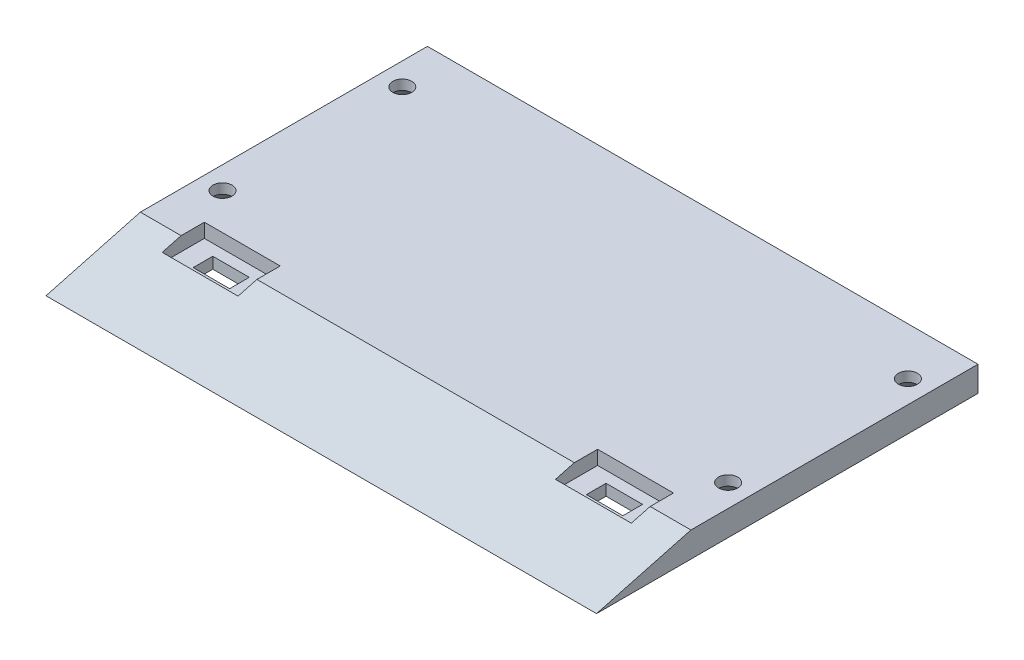
ISO-10303-21;
HEADER;
FILE_DESCRIPTION(('STEP AP214'),'2;1');
FILE_NAME('part.step','',(''),(''),'','','');
FILE_SCHEMA(('AUTOMOTIVE_DESIGN { 1 0 10303 214 1 1 1 1 }'));
ENDSEC;
DATA;
#1=APPLICATION_CONTEXT('core data for automotive mechanical design processes');
#2=APPLICATION_PROTOCOL_DEFINITION('international standard','automotive_design',2000,#1);
#3=PRODUCT_CONTEXT('',#1,'mechanical');
#4=PRODUCT('Part','Part','',(#3));
#5=PRODUCT_RELATED_PRODUCT_CATEGORY('part','',(#4));
#6=PRODUCT_DEFINITION_FORMATION('','',#4);
#7=PRODUCT_DEFINITION_CONTEXT('part definition',#1,'design');
#8=PRODUCT_DEFINITION('design','',#6,#7);
#9=PRODUCT_DEFINITION_SHAPE('','',#8);
#10=(LENGTH_UNIT() NAMED_UNIT(*) SI_UNIT(.MILLI.,.METRE.));
#11=(NAMED_UNIT(*) PLANE_ANGLE_UNIT() SI_UNIT($,.RADIAN.));
#12=(NAMED_UNIT(*) SI_UNIT($,.STERADIAN.) SOLID_ANGLE_UNIT());
#13=UNCERTAINTY_MEASURE_WITH_UNIT(LENGTH_MEASURE(1.E-05),#10,'distance_accuracy_value','');
#14=(GEOMETRIC_REPRESENTATION_CONTEXT(3) GLOBAL_UNCERTAINTY_ASSIGNED_CONTEXT((#13)) GLOBAL_UNIT_ASSIGNED_CONTEXT((#10,
#11,#12)) REPRESENTATION_CONTEXT('',''));
#15=CARTESIAN_POINT('',(0.,0.,0.));
#16=DIRECTION('',(0.,0.,1.));
#17=DIRECTION('',(1.,0.,0.));
#18=AXIS2_PLACEMENT_3D('',#15,#16,#17);
#19=CARTESIAN_POINT('',(100.,4.5,-16.7942286340604));
#20=DIRECTION('',(0.,-0.96592582628907,-0.258819045102515));
#21=DIRECTION('',(0.,0.258819045102515,-0.96592582628907));
#22=AXIS2_PLACEMENT_3D('',#19,#20,#21);
#23=PLANE('',#22);
#24=DIRECTION('',(0.,0.258819045102515,-0.96592582628907));
#25=VECTOR('',#24,1.);
#26=CARTESIAN_POINT('',(1.,4.5,-16.7942286340604));
#27=LINE('',#26,#25);
#28=CARTESIAN_POINT('',(1.,0.,0.));
#29=VERTEX_POINT('',#28);
#30=CARTESIAN_POINT('',(1.,4.5,-16.7942286340604));
#31=VERTEX_POINT('',#30);
#32=EDGE_CURVE('E54',#29,#31,#27,.T.);
#33=ORIENTED_EDGE('',*,*,#32,.F.);
#34=DIRECTION('',(-1.,0.,0.));
#35=VECTOR('',#34,1.);
#36=CARTESIAN_POINT('',(100.,0.,0.));
#37=LINE('',#36,#35);
#38=CARTESIAN_POINT('',(99.,0.,0.));
#39=VERTEX_POINT('',#38);
#40=EDGE_CURVE('E221',#39,#29,#37,.T.);
#41=ORIENTED_EDGE('',*,*,#40,.F.);
#42=DIRECTION('',(0.,-0.258819045102515,0.96592582628907));
#43=VECTOR('',#42,1.);
#44=CARTESIAN_POINT('',(99.,4.5,-16.7942286340604));
#45=LINE('',#44,#43);
#46=CARTESIAN_POINT('',(99.,4.5,-16.7942286340604));
#47=VERTEX_POINT('',#46);
#48=EDGE_CURVE('E257',#47,#39,#45,.T.);
#49=ORIENTED_EDGE('',*,*,#48,.F.);
#50=DIRECTION('',(-1.,0.,0.));
#51=VECTOR('',#50,1.);
#52=CARTESIAN_POINT('',(100.,4.5,-16.7942286340604));
#53=LINE('',#52,#51);
#54=CARTESIAN_POINT('',(91.75,4.5,-16.7942286340604));
#55=VERTEX_POINT('',#54);
#56=EDGE_CURVE('E227',#47,#55,#53,.T.);
#57=ORIENTED_EDGE('',*,*,#56,.T.);
#58=DIRECTION('',(0.,-0.258819045102515,0.96592582628907));
#59=VECTOR('',#58,1.);
#60=CARTESIAN_POINT('',(91.75,4.5,-16.7942286340604));
#61=LINE('',#60,#59);
#62=CARTESIAN_POINT('',(91.75,3.6012371462742,-13.44));
#63=VERTEX_POINT('',#62);
#64=EDGE_CURVE('E241',#55,#63,#61,.T.);
#65=ORIENTED_EDGE('',*,*,#64,.T.);
#66=DIRECTION('',(-1.,0.,0.));
#67=VECTOR('',#66,1.);
#68=CARTESIAN_POINT('',(100.,3.60123714627418,-13.4399999999999));
#69=LINE('',#68,#67);
#70=CARTESIAN_POINT('',(78.25,3.6012371462742,-13.44));
#71=VERTEX_POINT('',#70);
#72=EDGE_CURVE('E47',#63,#71,#69,.T.);
#73=ORIENTED_EDGE('',*,*,#72,.T.);
#74=DIRECTION('',(0.,0.258819045102515,-0.96592582628907));
#75=VECTOR('',#74,1.);
#76=CARTESIAN_POINT('',(78.25,4.5,-16.7942286340604));
#77=LINE('',#76,#75);
#78=CARTESIAN_POINT('',(78.25,4.5,-16.7942286340604));
#79=VERTEX_POINT('',#78);
#80=EDGE_CURVE('E238',#71,#79,#77,.T.);
#81=ORIENTED_EDGE('',*,*,#80,.T.);
#82=CARTESIAN_POINT('',(21.75,4.5,-16.7942286340604));
#83=VERTEX_POINT('',#82);
#84=EDGE_CURVE('E386',#79,#83,#53,.T.);
#85=ORIENTED_EDGE('',*,*,#84,.T.);
#86=DIRECTION('',(0.,-0.258819045102515,0.96592582628907));
#87=VECTOR('',#86,1.);
#88=CARTESIAN_POINT('',(21.75,4.5,-16.7942286340604));
#89=LINE('',#88,#87);
#90=CARTESIAN_POINT('',(21.75,3.60123714627421,-13.4400000000001));
#91=VERTEX_POINT('',#90);
#92=EDGE_CURVE('E301',#83,#91,#89,.T.);
#93=ORIENTED_EDGE('',*,*,#92,.T.);
#94=DIRECTION('',(-1.,0.,0.));
#95=VECTOR('',#94,1.);
#96=CARTESIAN_POINT('',(100.,3.60123714627421,-13.4400000000001));
#97=LINE('',#96,#95);
#98=CARTESIAN_POINT('',(8.25000000000001,3.60123714627421,-13.4400000000001));
#99=VERTEX_POINT('',#98);
#100=EDGE_CURVE('E11',#91,#99,#97,.T.);
#101=ORIENTED_EDGE('',*,*,#100,.T.);
#102=DIRECTION('',(0.,0.258819045102515,-0.96592582628907));
#103=VECTOR('',#102,1.);
#104=CARTESIAN_POINT('',(8.25000000000001,4.49999999999999,-16.7942286340604));
#105=LINE('',#104,#103);
#106=CARTESIAN_POINT('',(8.25000000000001,4.5,-16.7942286340604));
#107=VERTEX_POINT('',#106);
#108=EDGE_CURVE('E298',#99,#107,#105,.T.);
#109=ORIENTED_EDGE('',*,*,#108,.T.);
#110=EDGE_CURVE('E385',#107,#31,#53,.T.);
#111=ORIENTED_EDGE('',*,*,#110,.T.);
#112=EDGE_LOOP('',(#33,#41,#49,#57,#65,#73,#81,#85,#93,#101,#109,#111));
#113=FACE_BOUND('',#112,.T.);
#114=ADVANCED_FACE('F40',(#113),#23,.F.);
#115=CARTESIAN_POINT('',(100.,0.,0.));
#116=DIRECTION('',(0.,1.,0.));
#117=DIRECTION('',(0.,0.,1.));
#118=AXIS2_PLACEMENT_3D('',#115,#116,#117);
#119=PLANE('',#118);
#120=DIRECTION('',(1.,0.,0.));
#121=VECTOR('',#120,1.);
#122=CARTESIAN_POINT('',(11.75,0.,-15.4400000000001));
#123=LINE('',#122,#121);
#124=CARTESIAN_POINT('',(11.75,0.,-15.4400000000001));
#125=VERTEX_POINT('',#124);
#126=CARTESIAN_POINT('',(18.25,0.,-15.4400000000001));
#127=VERTEX_POINT('',#126);
#128=EDGE_CURVE('E315',#125,#127,#123,.T.);
#129=ORIENTED_EDGE('',*,*,#128,.T.);
#130=DIRECTION('',(0.,0.,-1.));
#131=VECTOR('',#130,1.);
#132=CARTESIAN_POINT('',(18.25,0.,-18.9400000000001));
#133=LINE('',#132,#131);
#134=CARTESIAN_POINT('',(18.25,0.,-18.9400000000001));
#135=VERTEX_POINT('',#134);
#136=EDGE_CURVE('E305',#127,#135,#133,.T.);
#137=ORIENTED_EDGE('',*,*,#136,.T.);
#138=DIRECTION('',(-1.,0.,0.));
#139=VECTOR('',#138,1.);
#140=CARTESIAN_POINT('',(11.75,0.,-18.9400000000001));
#141=LINE('',#140,#139);
#142=CARTESIAN_POINT('',(11.75,0.,-18.9400000000001));
#143=VERTEX_POINT('',#142);
#144=EDGE_CURVE('E308',#135,#143,#141,.T.);
#145=ORIENTED_EDGE('',*,*,#144,.T.);
#146=DIRECTION('',(0.,0.,1.));
#147=VECTOR('',#146,1.);
#148=CARTESIAN_POINT('',(11.75,0.,-18.9400000000001));
#149=LINE('',#148,#147);
#150=EDGE_CURVE('E312',#143,#125,#149,.T.);
#151=ORIENTED_EDGE('',*,*,#150,.T.);
#152=EDGE_LOOP('',(#129,#137,#145,#151));
#153=FACE_BOUND('',#152,.T.);
#154=DIRECTION('',(1.,0.,0.));
#155=VECTOR('',#154,1.);
#156=CARTESIAN_POINT('',(81.75,0.,-15.4400000000001));
#157=LINE('',#156,#155);
#158=CARTESIAN_POINT('',(81.75,0.,-15.4400000000001));
#159=VERTEX_POINT('',#158);
#160=CARTESIAN_POINT('',(88.25,0.,-15.4400000000001));
#161=VERTEX_POINT('',#160);
#162=EDGE_CURVE('E334',#159,#161,#157,.T.);
#163=ORIENTED_EDGE('',*,*,#162,.T.);
#164=DIRECTION('',(0.,0.,-1.));
#165=VECTOR('',#164,1.);
#166=CARTESIAN_POINT('',(88.25,0.,-18.9400000000001));
#167=LINE('',#166,#165);
#168=CARTESIAN_POINT('',(88.25,0.,-18.9400000000001));
#169=VERTEX_POINT('',#168);
#170=EDGE_CURVE('E309',#161,#169,#167,.T.);
#171=ORIENTED_EDGE('',*,*,#170,.T.);
#172=DIRECTION('',(-1.,0.,0.));
#173=VECTOR('',#172,1.);
#174=CARTESIAN_POINT('',(81.75,0.,-18.9400000000001));
#175=LINE('',#174,#173);
#176=CARTESIAN_POINT('',(81.75,0.,-18.9400000000001));
#177=VERTEX_POINT('',#176);
#178=EDGE_CURVE('E348',#169,#177,#175,.T.);
#179=ORIENTED_EDGE('',*,*,#178,.T.);
#180=DIRECTION('',(0.,0.,1.));
#181=VECTOR('',#180,1.);
#182=CARTESIAN_POINT('',(81.75,0.,-18.9400000000001));
#183=LINE('',#182,#181);
#184=EDGE_CURVE('E345',#177,#159,#183,.T.);
#185=ORIENTED_EDGE('',*,*,#184,.T.);
#186=EDGE_LOOP('',(#163,#171,#179,#185));
#187=FACE_BOUND('',#186,.T.);
#188=DIRECTION('',(0.,0.,1.));
#189=VECTOR('',#188,1.);
#190=CARTESIAN_POINT('',(1.,0.,-67.9));
#191=LINE('',#190,#189);
#192=CARTESIAN_POINT('',(1.,0.,-67.9));
#193=VERTEX_POINT('',#192);
#194=CARTESIAN_POINT('',(1.,0.,-59.4200000000006));
#195=VERTEX_POINT('',#194);
#196=EDGE_CURVE('E201',#193,#195,#191,.T.);
#197=ORIENTED_EDGE('',*,*,#196,.F.);
#198=DIRECTION('',(-1.,0.,0.));
#199=VECTOR('',#198,1.);
#200=CARTESIAN_POINT('',(100.,0.,-67.9));
#201=LINE('',#200,#199);
#202=CARTESIAN_POINT('',(99.,0.,-67.9));
#203=VERTEX_POINT('',#202);
#204=EDGE_CURVE('E215',#203,#193,#201,.T.);
#205=ORIENTED_EDGE('',*,*,#204,.F.);
#206=DIRECTION('',(0.,0.,-1.));
#207=VECTOR('',#206,1.);
#208=CARTESIAN_POINT('',(99.,0.,0.));
#209=LINE('',#208,#207);
#210=CARTESIAN_POINT('',(99.,0.,-59.42));
#211=VERTEX_POINT('',#210);
#212=EDGE_CURVE('E398',#211,#203,#209,.T.);
#213=ORIENTED_EDGE('',*,*,#212,.F.);
#214=CARTESIAN_POINT('',(95.,0.,-59.42));
#215=DIRECTION('',(0.,-1.,0.));
#216=DIRECTION('',(0.,0.,-1.));
#217=AXIS2_PLACEMENT_3D('',#214,#215,#216);
#218=CIRCLE('',#217,4.);
#219=EDGE_CURVE('E322',#211,#211,#218,.T.);
#220=ORIENTED_EDGE('',*,*,#219,.F.);
#221=CARTESIAN_POINT('',(99.,0.,-27.42));
#222=VERTEX_POINT('',#221);
#223=EDGE_CURVE('E403',#222,#211,#209,.T.);
#224=ORIENTED_EDGE('',*,*,#223,.F.);
#225=CARTESIAN_POINT('',(94.9999999999999,0.,-27.42));
#226=DIRECTION('',(0.,-1.,0.));
#227=DIRECTION('',(0.,0.,-1.));
#228=AXIS2_PLACEMENT_3D('',#225,#226,#227);
#229=CIRCLE('',#228,4.);
#230=EDGE_CURVE('E377',#222,#222,#229,.T.);
#231=ORIENTED_EDGE('',*,*,#230,.F.);
#232=EDGE_CURVE('E401',#39,#222,#209,.T.);
#233=ORIENTED_EDGE('',*,*,#232,.F.);
#234=ORIENTED_EDGE('',*,*,#40,.T.);
#235=CARTESIAN_POINT('',(1.,0.,-27.4200000000006));
#236=VERTEX_POINT('',#235);
#237=EDGE_CURVE('E208',#236,#29,#191,.T.);
#238=ORIENTED_EDGE('',*,*,#237,.F.);
#239=CARTESIAN_POINT('',(4.99999999999989,0.,-27.4200000000006));
#240=DIRECTION('',(0.,-1.,0.));
#241=DIRECTION('',(0.,0.,-1.));
#242=AXIS2_PLACEMENT_3D('',#239,#240,#241);
#243=CIRCLE('',#242,4.);
#244=EDGE_CURVE('E368',#236,#236,#243,.T.);
#245=ORIENTED_EDGE('',*,*,#244,.F.);
#246=EDGE_CURVE('E218',#195,#236,#191,.T.);
#247=ORIENTED_EDGE('',*,*,#246,.F.);
#248=CARTESIAN_POINT('',(5.,0.,-59.4200000000006));
#249=DIRECTION('',(0.,-1.,0.));
#250=DIRECTION('',(0.,0.,-1.));
#251=AXIS2_PLACEMENT_3D('',#248,#249,#250);
#252=CIRCLE('',#251,4.);
#253=EDGE_CURVE('E217',#195,#195,#252,.T.);
#254=ORIENTED_EDGE('',*,*,#253,.F.);
#255=EDGE_LOOP('',(#197,#205,#213,#220,#224,#231,#233,#234,#238,#245,#247,#254));
#256=FACE_BOUND('',#255,.T.);
#257=ADVANCED_FACE('F213',(#153,#187,#256),#119,.F.);
#258=CARTESIAN_POINT('',(100.,4.5,-67.9));
#259=DIRECTION('',(0.,0.,1.));
#260=DIRECTION('',(1.,0.,0.));
#261=AXIS2_PLACEMENT_3D('',#258,#259,#260);
#262=PLANE('',#261);
#263=DIRECTION('',(0.,-1.,0.));
#264=VECTOR('',#263,1.);
#265=CARTESIAN_POINT('',(1.,8.52918467213869,-67.9));
#266=LINE('',#265,#264);
#267=CARTESIAN_POINT('',(1.,4.5,-67.9));
#268=VERTEX_POINT('',#267);
#269=EDGE_CURVE('E198',#268,#193,#266,.T.);
#270=ORIENTED_EDGE('',*,*,#269,.F.);
#271=DIRECTION('',(-1.,0.,0.));
#272=VECTOR('',#271,1.);
#273=CARTESIAN_POINT('',(100.,4.5,-67.9));
#274=LINE('',#273,#272);
#275=CARTESIAN_POINT('',(99.,4.5,-67.9));
#276=VERTEX_POINT('',#275);
#277=EDGE_CURVE('E222',#276,#268,#274,.T.);
#278=ORIENTED_EDGE('',*,*,#277,.F.);
#279=DIRECTION('',(0.,1.,0.));
#280=VECTOR('',#279,1.);
#281=CARTESIAN_POINT('',(99.,0.,-67.9));
#282=LINE('',#281,#280);
#283=EDGE_CURVE('E62',#203,#276,#282,.T.);
#284=ORIENTED_EDGE('',*,*,#283,.F.);
#285=ORIENTED_EDGE('',*,*,#204,.T.);
#286=EDGE_LOOP('',(#270,#278,#284,#285));
#287=FACE_BOUND('',#286,.T.);
#288=ADVANCED_FACE('F220',(#287),#262,.F.);
#289=CARTESIAN_POINT('',(100.,4.5,-16.7942286340604));
#290=DIRECTION('',(0.,-1.,0.));
#291=DIRECTION('',(0.,0.,-1.));
#292=AXIS2_PLACEMENT_3D('',#289,#290,#291);
#293=PLANE('',#292);
#294=CARTESIAN_POINT('',(95.,4.5,-59.42));
#295=DIRECTION('',(0.,-1.,0.));
#296=DIRECTION('',(0.,0.,-1.));
#297=AXIS2_PLACEMENT_3D('',#294,#295,#296);
#298=CIRCLE('',#297,1.69999999999999);
#299=CARTESIAN_POINT('',(95.,4.5,-61.12));
#300=VERTEX_POINT('',#299);
#301=EDGE_CURVE('E358',#300,#300,#298,.T.);
#302=ORIENTED_EDGE('',*,*,#301,.T.);
#303=EDGE_LOOP('',(#302));
#304=FACE_BOUND('',#303,.T.);
#305=CARTESIAN_POINT('',(5.,4.5,-59.4200000000006));
#306=DIRECTION('',(0.,-1.,0.));
#307=DIRECTION('',(0.,0.,-1.));
#308=AXIS2_PLACEMENT_3D('',#305,#306,#307);
#309=CIRCLE('',#308,1.7);
#310=CARTESIAN_POINT('',(5.,4.5,-61.1200000000006));
#311=VERTEX_POINT('',#310);
#312=EDGE_CURVE('E365',#311,#311,#309,.T.);
#313=ORIENTED_EDGE('',*,*,#312,.T.);
#314=EDGE_LOOP('',(#313));
#315=FACE_BOUND('',#314,.T.);
#316=CARTESIAN_POINT('',(4.99999999999989,4.5,-27.4200000000006));
#317=DIRECTION('',(0.,-1.,0.));
#318=DIRECTION('',(0.,0.,-1.));
#319=AXIS2_PLACEMENT_3D('',#316,#317,#318);
#320=CIRCLE('',#319,1.7);
#321=CARTESIAN_POINT('',(4.99999999999989,4.5,-29.1200000000006));
#322=VERTEX_POINT('',#321);
#323=EDGE_CURVE('E374',#322,#322,#320,.T.);
#324=ORIENTED_EDGE('',*,*,#323,.T.);
#325=EDGE_LOOP('',(#324));
#326=FACE_BOUND('',#325,.T.);
#327=CARTESIAN_POINT('',(94.9999999999999,4.5,-27.42));
#328=DIRECTION('',(0.,-1.,0.));
#329=DIRECTION('',(0.,0.,-1.));
#330=AXIS2_PLACEMENT_3D('',#327,#328,#329);
#331=CIRCLE('',#330,1.69999999999999);
#332=CARTESIAN_POINT('',(94.9999999999999,4.5,-29.12));
#333=VERTEX_POINT('',#332);
#334=EDGE_CURVE('E383',#333,#333,#331,.T.);
#335=ORIENTED_EDGE('',*,*,#334,.T.);
#336=EDGE_LOOP('',(#335));
#337=FACE_BOUND('',#336,.T.);
#338=DIRECTION('',(0.,0.,-1.));
#339=VECTOR('',#338,1.);
#340=CARTESIAN_POINT('',(1.,4.5,-16.7942286340604));
#341=LINE('',#340,#339);
#342=EDGE_CURVE('E203',#31,#268,#341,.T.);
#343=ORIENTED_EDGE('',*,*,#342,.F.);
#344=ORIENTED_EDGE('',*,*,#110,.F.);
#345=DIRECTION('',(0.,0.,1.));
#346=VECTOR('',#345,1.);
#347=CARTESIAN_POINT('',(8.25000000000001,4.5,-20.9400000000001));
#348=LINE('',#347,#346);
#349=CARTESIAN_POINT('',(8.25000000000001,4.5,-20.9400000000001));
#350=VERTEX_POINT('',#349);
#351=EDGE_CURVE('E396',#350,#107,#348,.T.);
#352=ORIENTED_EDGE('',*,*,#351,.F.);
#353=DIRECTION('',(-1.,0.,0.));
#354=VECTOR('',#353,1.);
#355=CARTESIAN_POINT('',(8.25000000000001,4.5,-20.9400000000001));
#356=LINE('',#355,#354);
#357=CARTESIAN_POINT('',(21.75,4.5,-20.9400000000001));
#358=VERTEX_POINT('',#357);
#359=EDGE_CURVE('E421',#358,#350,#356,.T.);
#360=ORIENTED_EDGE('',*,*,#359,.F.);
#361=DIRECTION('',(0.,0.,-1.));
#362=VECTOR('',#361,1.);
#363=CARTESIAN_POINT('',(21.75,4.5,-20.9400000000001));
#364=LINE('',#363,#362);
#365=EDGE_CURVE('E272',#83,#358,#364,.T.);
#366=ORIENTED_EDGE('',*,*,#365,.F.);
#367=ORIENTED_EDGE('',*,*,#84,.F.);
#368=DIRECTION('',(0.,0.,1.));
#369=VECTOR('',#368,1.);
#370=CARTESIAN_POINT('',(78.25,4.5,-20.94));
#371=LINE('',#370,#369);
#372=CARTESIAN_POINT('',(78.25,4.5,-20.94));
#373=VERTEX_POINT('',#372);
#374=EDGE_CURVE('E265',#373,#79,#371,.T.);
#375=ORIENTED_EDGE('',*,*,#374,.F.);
#376=DIRECTION('',(-1.,0.,0.));
#377=VECTOR('',#376,1.);
#378=CARTESIAN_POINT('',(78.25,4.5,-20.94));
#379=LINE('',#378,#377);
#380=CARTESIAN_POINT('',(91.75,4.5,-20.94));
#381=VERTEX_POINT('',#380);
#382=EDGE_CURVE('E267',#381,#373,#379,.T.);
#383=ORIENTED_EDGE('',*,*,#382,.F.);
#384=DIRECTION('',(0.,0.,-1.));
#385=VECTOR('',#384,1.);
#386=CARTESIAN_POINT('',(91.75,4.5,-20.94));
#387=LINE('',#386,#385);
#388=EDGE_CURVE('E270',#55,#381,#387,.T.);
#389=ORIENTED_EDGE('',*,*,#388,.F.);
#390=ORIENTED_EDGE('',*,*,#56,.F.);
#391=DIRECTION('',(0.,0.,1.));
#392=VECTOR('',#391,1.);
#393=CARTESIAN_POINT('',(99.,4.5,-16.7942286340604));
#394=LINE('',#393,#392);
#395=EDGE_CURVE('E261',#276,#47,#394,.T.);
#396=ORIENTED_EDGE('',*,*,#395,.F.);
#397=ORIENTED_EDGE('',*,*,#277,.T.);
#398=EDGE_LOOP('',(#343,#344,#352,#360,#366,#367,#375,#383,#389,#390,#396,#397));
#399=FACE_BOUND('',#398,.T.);
#400=ADVANCED_FACE('F394',(#304,#315,#326,#337,#399),#293,.F.);
#401=CARTESIAN_POINT('',(81.75,0.,-15.4400000000001));
#402=DIRECTION('',(0.,0.,1.));
#403=DIRECTION('',(1.,0.,0.));
#404=AXIS2_PLACEMENT_3D('',#401,#402,#403);
#405=PLANE('',#404);
#406=DIRECTION('',(-1.,0.,0.));
#407=VECTOR('',#406,1.);
#408=CARTESIAN_POINT('',(81.75,2.,-15.4400000000001));
#409=LINE('',#408,#407);
#410=CARTESIAN_POINT('',(88.25,2.,-15.4400000000001));
#411=VERTEX_POINT('',#410);
#412=CARTESIAN_POINT('',(81.75,2.,-15.4400000000001));
#413=VERTEX_POINT('',#412);
#414=EDGE_CURVE('E294',#411,#413,#409,.T.);
#415=ORIENTED_EDGE('',*,*,#414,.F.);
#416=DIRECTION('',(0.,1.,0.));
#417=VECTOR('',#416,1.);
#418=CARTESIAN_POINT('',(88.25,0.,-15.4400000000001));
#419=LINE('',#418,#417);
#420=EDGE_CURVE('E304',#161,#411,#419,.T.);
#421=ORIENTED_EDGE('',*,*,#420,.F.);
#422=ORIENTED_EDGE('',*,*,#162,.F.);
#423=DIRECTION('',(0.,1.,0.));
#424=VECTOR('',#423,1.);
#425=CARTESIAN_POINT('',(81.75,0.,-15.4400000000001));
#426=LINE('',#425,#424);
#427=EDGE_CURVE('E338',#159,#413,#426,.T.);
#428=ORIENTED_EDGE('',*,*,#427,.T.);
#429=EDGE_LOOP('',(#415,#421,#422,#428));
#430=FACE_BOUND('',#429,.T.);
#431=ADVANCED_FACE('F480',(#430),#405,.F.);
#432=CARTESIAN_POINT('',(88.25,0.,-18.9400000000001));
#433=DIRECTION('',(1.,0.,0.));
#434=DIRECTION('',(0.,0.,-1.));
#435=AXIS2_PLACEMENT_3D('',#432,#433,#434);
#436=PLANE('',#435);
#437=DIRECTION('',(0.,0.,1.));
#438=VECTOR('',#437,1.);
#439=CARTESIAN_POINT('',(88.25,2.,-18.9400000000001));
#440=LINE('',#439,#438);
#441=CARTESIAN_POINT('',(88.25,2.,-18.9400000000001));
#442=VERTEX_POINT('',#441);
#443=EDGE_CURVE('E292',#442,#411,#440,.T.);
#444=ORIENTED_EDGE('',*,*,#443,.F.);
#445=DIRECTION('',(0.,1.,0.));
#446=VECTOR('',#445,1.);
#447=CARTESIAN_POINT('',(88.25,0.,-18.9400000000001));
#448=LINE('',#447,#446);
#449=EDGE_CURVE('E331',#169,#442,#448,.T.);
#450=ORIENTED_EDGE('',*,*,#449,.F.);
#451=ORIENTED_EDGE('',*,*,#170,.F.);
#452=ORIENTED_EDGE('',*,*,#420,.T.);
#453=EDGE_LOOP('',(#444,#450,#451,#452));
#454=FACE_BOUND('',#453,.T.);
#455=ADVANCED_FACE('F517',(#454),#436,.F.);
#456=CARTESIAN_POINT('',(81.75,0.,-18.9400000000001));
#457=DIRECTION('',(-1.,0.,0.));
#458=DIRECTION('',(0.,0.,1.));
#459=AXIS2_PLACEMENT_3D('',#456,#457,#458);
#460=PLANE('',#459);
#461=DIRECTION('',(0.,0.,-1.));
#462=VECTOR('',#461,1.);
#463=CARTESIAN_POINT('',(81.75,2.,-18.9400000000001));
#464=LINE('',#463,#462);
#465=CARTESIAN_POINT('',(81.75,2.,-18.9400000000001));
#466=VERTEX_POINT('',#465);
#467=EDGE_CURVE('E290',#413,#466,#464,.T.);
#468=ORIENTED_EDGE('',*,*,#467,.F.);
#469=ORIENTED_EDGE('',*,*,#427,.F.);
#470=ORIENTED_EDGE('',*,*,#184,.F.);
#471=DIRECTION('',(0.,1.,0.));
#472=VECTOR('',#471,1.);
#473=CARTESIAN_POINT('',(81.75,0.,-18.9400000000001));
#474=LINE('',#473,#472);
#475=EDGE_CURVE('E335',#177,#466,#474,.T.);
#476=ORIENTED_EDGE('',*,*,#475,.T.);
#477=EDGE_LOOP('',(#468,#469,#470,#476));
#478=FACE_BOUND('',#477,.T.);
#479=ADVANCED_FACE('F519',(#478),#460,.F.);
#480=CARTESIAN_POINT('',(81.75,0.,-18.9400000000001));
#481=DIRECTION('',(0.,0.,-1.));
#482=DIRECTION('',(-1.,0.,0.));
#483=AXIS2_PLACEMENT_3D('',#480,#481,#482);
#484=PLANE('',#483);
#485=DIRECTION('',(1.,0.,0.));
#486=VECTOR('',#485,1.);
#487=CARTESIAN_POINT('',(81.75,2.,-18.9400000000001));
#488=LINE('',#487,#486);
#489=EDGE_CURVE('E232',#466,#442,#488,.T.);
#490=ORIENTED_EDGE('',*,*,#489,.F.);
#491=ORIENTED_EDGE('',*,*,#475,.F.);
#492=ORIENTED_EDGE('',*,*,#178,.F.);
#493=ORIENTED_EDGE('',*,*,#449,.T.);
#494=EDGE_LOOP('',(#490,#491,#492,#493));
#495=FACE_BOUND('',#494,.T.);
#496=ADVANCED_FACE('F522',(#495),#484,.F.);
#497=CARTESIAN_POINT('',(11.75,0.,-15.4400000000001));
#498=DIRECTION('',(0.,0.,1.));
#499=DIRECTION('',(1.,0.,0.));
#500=AXIS2_PLACEMENT_3D('',#497,#498,#499);
#501=PLANE('',#500);
#502=DIRECTION('',(-1.,0.,0.));
#503=VECTOR('',#502,1.);
#504=CARTESIAN_POINT('',(11.75,2.,-15.4400000000001));
#505=LINE('',#504,#503);
#506=CARTESIAN_POINT('',(18.25,2.,-15.4400000000001));
#507=VERTEX_POINT('',#506);
#508=CARTESIAN_POINT('',(11.75,2.,-15.4400000000001));
#509=VERTEX_POINT('',#508);
#510=EDGE_CURVE('E288',#507,#509,#505,.T.);
#511=ORIENTED_EDGE('',*,*,#510,.F.);
#512=DIRECTION('',(0.,1.,0.));
#513=VECTOR('',#512,1.);
#514=CARTESIAN_POINT('',(18.25,0.,-15.4400000000001));
#515=LINE('',#514,#513);
#516=EDGE_CURVE('E319',#127,#507,#515,.T.);
#517=ORIENTED_EDGE('',*,*,#516,.F.);
#518=ORIENTED_EDGE('',*,*,#128,.F.);
#519=DIRECTION('',(0.,1.,0.));
#520=VECTOR('',#519,1.);
#521=CARTESIAN_POINT('',(11.75,0.,-15.4400000000001));
#522=LINE('',#521,#520);
#523=EDGE_CURVE('E323',#125,#509,#522,.T.);
#524=ORIENTED_EDGE('',*,*,#523,.T.);
#525=EDGE_LOOP('',(#511,#517,#518,#524));
#526=FACE_BOUND('',#525,.T.);
#527=ADVANCED_FACE('F526',(#526),#501,.F.);
#528=CARTESIAN_POINT('',(18.25,0.,-18.9400000000001));
#529=DIRECTION('',(1.,0.,0.));
#530=DIRECTION('',(0.,0.,-1.));
#531=AXIS2_PLACEMENT_3D('',#528,#529,#530);
#532=PLANE('',#531);
#533=DIRECTION('',(0.,0.,1.));
#534=VECTOR('',#533,1.);
#535=CARTESIAN_POINT('',(18.25,2.,-18.9400000000001));
#536=LINE('',#535,#534);
#537=CARTESIAN_POINT('',(18.25,2.,-18.9400000000001));
#538=VERTEX_POINT('',#537);
#539=EDGE_CURVE('E285',#538,#507,#536,.T.);
#540=ORIENTED_EDGE('',*,*,#539,.F.);
#541=DIRECTION('',(0.,1.,0.));
#542=VECTOR('',#541,1.);
#543=CARTESIAN_POINT('',(18.25,0.,-18.9400000000001));
#544=LINE('',#543,#542);
#545=EDGE_CURVE('E318',#135,#538,#544,.T.);
#546=ORIENTED_EDGE('',*,*,#545,.F.);
#547=ORIENTED_EDGE('',*,*,#136,.F.);
#548=ORIENTED_EDGE('',*,*,#516,.T.);
#549=EDGE_LOOP('',(#540,#546,#547,#548));
#550=FACE_BOUND('',#549,.T.);
#551=ADVANCED_FACE('F531',(#550),#532,.F.);
#552=CARTESIAN_POINT('',(11.75,0.,-18.9400000000001));
#553=DIRECTION('',(-1.,0.,0.));
#554=DIRECTION('',(0.,0.,1.));
#555=AXIS2_PLACEMENT_3D('',#552,#553,#554);
#556=PLANE('',#555);
#557=DIRECTION('',(0.,0.,-1.));
#558=VECTOR('',#557,1.);
#559=CARTESIAN_POINT('',(11.75,2.,-18.9400000000001));
#560=LINE('',#559,#558);
#561=CARTESIAN_POINT('',(11.75,2.,-18.9400000000001));
#562=VERTEX_POINT('',#561);
#563=EDGE_CURVE('E283',#509,#562,#560,.T.);
#564=ORIENTED_EDGE('',*,*,#563,.F.);
#565=ORIENTED_EDGE('',*,*,#523,.F.);
#566=ORIENTED_EDGE('',*,*,#150,.F.);
#567=DIRECTION('',(0.,1.,0.));
#568=VECTOR('',#567,1.);
#569=CARTESIAN_POINT('',(11.75,0.,-18.9400000000001));
#570=LINE('',#569,#568);
#571=EDGE_CURVE('E326',#143,#562,#570,.T.);
#572=ORIENTED_EDGE('',*,*,#571,.T.);
#573=EDGE_LOOP('',(#564,#565,#566,#572));
#574=FACE_BOUND('',#573,.T.);
#575=ADVANCED_FACE('F534',(#574),#556,.F.);
#576=CARTESIAN_POINT('',(11.75,0.,-18.9400000000001));
#577=DIRECTION('',(0.,0.,-1.));
#578=DIRECTION('',(-1.,0.,0.));
#579=AXIS2_PLACEMENT_3D('',#576,#577,#578);
#580=PLANE('',#579);
#581=DIRECTION('',(1.,0.,0.));
#582=VECTOR('',#581,1.);
#583=CARTESIAN_POINT('',(11.75,2.,-18.9400000000001));
#584=LINE('',#583,#582);
#585=EDGE_CURVE('E225',#562,#538,#584,.T.);
#586=ORIENTED_EDGE('',*,*,#585,.F.);
#587=ORIENTED_EDGE('',*,*,#571,.F.);
#588=ORIENTED_EDGE('',*,*,#144,.F.);
#589=ORIENTED_EDGE('',*,*,#545,.T.);
#590=EDGE_LOOP('',(#586,#587,#588,#589));
#591=FACE_BOUND('',#590,.T.);
#592=ADVANCED_FACE('F486',(#591),#580,.F.);
#593=CARTESIAN_POINT('',(94.9999999999999,0.,-27.42));
#594=DIRECTION('',(0.,-1.,0.));
#595=DIRECTION('',(0.,0.,-1.));
#596=AXIS2_PLACEMENT_3D('',#593,#594,#595);
#597=CYLINDRICAL_SURFACE('',#596,1.69999999999999);
#598=ORIENTED_EDGE('',*,*,#334,.F.);
#599=EDGE_LOOP('',(#598));
#600=FACE_BOUND('',#599,.T.);
#601=CARTESIAN_POINT('',(94.9999999999999,2.74103326296668,-27.42));
#602=DIRECTION('',(0.,-1.,0.));
#603=DIRECTION('',(0.,0.,-1.));
#604=AXIS2_PLACEMENT_3D('',#601,#602,#603);
#605=CIRCLE('',#604,1.69999999999999);
#606=CARTESIAN_POINT('',(94.9999999999999,2.74103326296668,-29.12));
#607=VERTEX_POINT('',#606);
#608=EDGE_CURVE('E380',#607,#607,#605,.T.);
#609=ORIENTED_EDGE('',*,*,#608,.T.);
#610=EDGE_LOOP('',(#609));
#611=FACE_BOUND('',#610,.T.);
#612=ADVANCED_FACE('F482',(#600,#611),#597,.F.);
#613=CARTESIAN_POINT('',(94.9999999999999,0.,-27.42));
#614=DIRECTION('',(0.,-1.,0.));
#615=DIRECTION('',(0.,0.,-1.));
#616=AXIS2_PLACEMENT_3D('',#613,#614,#615);
#617=CONICAL_SURFACE('',#616,4.,0.698131700797735);
#618=ORIENTED_EDGE('',*,*,#608,.F.);
#619=EDGE_LOOP('',(#618));
#620=FACE_BOUND('',#619,.T.);
#621=ORIENTED_EDGE('',*,*,#230,.T.);
#622=EDGE_LOOP('',(#621));
#623=FACE_BOUND('',#622,.T.);
#624=ADVANCED_FACE('F485',(#620,#623),#617,.F.);
#625=CARTESIAN_POINT('',(4.99999999999989,0.,-27.4200000000006));
#626=DIRECTION('',(0.,-1.,0.));
#627=DIRECTION('',(0.,0.,-1.));
#628=AXIS2_PLACEMENT_3D('',#625,#626,#627);
#629=CYLINDRICAL_SURFACE('',#628,1.7);
#630=ORIENTED_EDGE('',*,*,#323,.F.);
#631=EDGE_LOOP('',(#630));
#632=FACE_BOUND('',#631,.T.);
#633=CARTESIAN_POINT('',(4.99999999999989,2.74103326296668,-27.4200000000006));
#634=DIRECTION('',(0.,-1.,0.));
#635=DIRECTION('',(0.,0.,-1.));
#636=AXIS2_PLACEMENT_3D('',#633,#634,#635);
#637=CIRCLE('',#636,1.7);
#638=CARTESIAN_POINT('',(4.99999999999989,2.74103326296668,-29.1200000000006));
#639=VERTEX_POINT('',#638);
#640=EDGE_CURVE('E371',#639,#639,#637,.T.);
#641=ORIENTED_EDGE('',*,*,#640,.T.);
#642=EDGE_LOOP('',(#641));
#643=FACE_BOUND('',#642,.T.);
#644=ADVANCED_FACE('F490',(#632,#643),#629,.F.);
#645=CARTESIAN_POINT('',(4.99999999999989,0.,-27.4200000000006));
#646=DIRECTION('',(0.,-1.,0.));
#647=DIRECTION('',(0.,0.,-1.));
#648=AXIS2_PLACEMENT_3D('',#645,#646,#647);
#649=CONICAL_SURFACE('',#648,4.,0.698131700797733);
#650=ORIENTED_EDGE('',*,*,#640,.F.);
#651=EDGE_LOOP('',(#650));
#652=FACE_BOUND('',#651,.T.);
#653=ORIENTED_EDGE('',*,*,#244,.T.);
#654=EDGE_LOOP('',(#653));
#655=FACE_BOUND('',#654,.T.);
#656=ADVANCED_FACE('F494',(#652,#655),#649,.F.);
#657=CARTESIAN_POINT('',(5.,0.,-59.4200000000006));
#658=DIRECTION('',(0.,-1.,0.));
#659=DIRECTION('',(0.,0.,-1.));
#660=AXIS2_PLACEMENT_3D('',#657,#658,#659);
#661=CYLINDRICAL_SURFACE('',#660,1.7);
#662=ORIENTED_EDGE('',*,*,#312,.F.);
#663=EDGE_LOOP('',(#662));
#664=FACE_BOUND('',#663,.T.);
#665=CARTESIAN_POINT('',(5.,2.74103326296668,-59.4200000000006));
#666=DIRECTION('',(0.,-1.,0.));
#667=DIRECTION('',(0.,0.,-1.));
#668=AXIS2_PLACEMENT_3D('',#665,#666,#667);
#669=CIRCLE('',#668,1.7);
#670=CARTESIAN_POINT('',(5.,2.74103326296668,-61.1200000000006));
#671=VERTEX_POINT('',#670);
#672=EDGE_CURVE('E362',#671,#671,#669,.T.);
#673=ORIENTED_EDGE('',*,*,#672,.T.);
#674=EDGE_LOOP('',(#673));
#675=FACE_BOUND('',#674,.T.);
#676=ADVANCED_FACE('F498',(#664,#675),#661,.F.);
#677=CARTESIAN_POINT('',(5.,0.,-59.4200000000006));
#678=DIRECTION('',(0.,-1.,0.));
#679=DIRECTION('',(0.,0.,-1.));
#680=AXIS2_PLACEMENT_3D('',#677,#678,#679);
#681=CONICAL_SURFACE('',#680,4.,0.698131700797733);
#682=ORIENTED_EDGE('',*,*,#672,.F.);
#683=EDGE_LOOP('',(#682));
#684=FACE_BOUND('',#683,.T.);
#685=ORIENTED_EDGE('',*,*,#253,.T.);
#686=EDGE_LOOP('',(#685));
#687=FACE_BOUND('',#686,.T.);
#688=ADVANCED_FACE('F502',(#684,#687),#681,.F.);
#689=CARTESIAN_POINT('',(95.,0.,-59.42));
#690=DIRECTION('',(0.,-1.,0.));
#691=DIRECTION('',(0.,0.,-1.));
#692=AXIS2_PLACEMENT_3D('',#689,#690,#691);
#693=CYLINDRICAL_SURFACE('',#692,1.69999999999999);
#694=ORIENTED_EDGE('',*,*,#301,.F.);
#695=EDGE_LOOP('',(#694));
#696=FACE_BOUND('',#695,.T.);
#697=CARTESIAN_POINT('',(95.,2.74103326296668,-59.42));
#698=DIRECTION('',(0.,-1.,0.));
#699=DIRECTION('',(0.,0.,-1.));
#700=AXIS2_PLACEMENT_3D('',#697,#698,#699);
#701=CIRCLE('',#700,1.69999999999999);
#702=CARTESIAN_POINT('',(95.,2.74103326296668,-61.12));
#703=VERTEX_POINT('',#702);
#704=EDGE_CURVE('E355',#703,#703,#701,.T.);
#705=ORIENTED_EDGE('',*,*,#704,.T.);
#706=EDGE_LOOP('',(#705));
#707=FACE_BOUND('',#706,.T.);
#708=ADVANCED_FACE('F506',(#696,#707),#693,.F.);
#709=CARTESIAN_POINT('',(95.,0.,-59.42));
#710=DIRECTION('',(0.,-1.,0.));
#711=DIRECTION('',(0.,0.,-1.));
#712=AXIS2_PLACEMENT_3D('',#709,#710,#711);
#713=CONICAL_SURFACE('',#712,4.,0.698131700797735);
#714=ORIENTED_EDGE('',*,*,#704,.F.);
#715=EDGE_LOOP('',(#714));
#716=FACE_BOUND('',#715,.T.);
#717=ORIENTED_EDGE('',*,*,#219,.T.);
#718=EDGE_LOOP('',(#717));
#719=FACE_BOUND('',#718,.T.);
#720=ADVANCED_FACE('F510',(#716,#719),#713,.F.);
#721=CARTESIAN_POINT('',(8.25000000000001,2.,-13.4400000000001));
#722=DIRECTION('',(0.,0.,1.));
#723=DIRECTION('',(1.,0.,0.));
#724=AXIS2_PLACEMENT_3D('',#721,#722,#723);
#725=PLANE('',#724);
#726=DIRECTION('',(0.,1.,0.));
#727=VECTOR('',#726,1.);
#728=CARTESIAN_POINT('',(21.75,2.,-13.4400000000001));
#729=LINE('',#728,#727);
#730=CARTESIAN_POINT('',(21.75,2.,-13.4400000000001));
#731=VERTEX_POINT('',#730);
#732=EDGE_CURVE('E286',#731,#91,#729,.T.);
#733=ORIENTED_EDGE('',*,*,#732,.F.);
#734=DIRECTION('',(1.,0.,0.));
#735=VECTOR('',#734,1.);
#736=CARTESIAN_POINT('',(8.25000000000001,2.,-13.4400000000001));
#737=LINE('',#736,#735);
#738=CARTESIAN_POINT('',(8.25000000000001,2.,-13.4400000000001));
#739=VERTEX_POINT('',#738);
#740=EDGE_CURVE('E415',#739,#731,#737,.T.);
#741=ORIENTED_EDGE('',*,*,#740,.F.);
#742=DIRECTION('',(0.,1.,0.));
#743=VECTOR('',#742,1.);
#744=CARTESIAN_POINT('',(8.25000000000001,2.,-13.4400000000001));
#745=LINE('',#744,#743);
#746=EDGE_CURVE('E427',#739,#99,#745,.T.);
#747=ORIENTED_EDGE('',*,*,#746,.T.);
#748=ORIENTED_EDGE('',*,*,#100,.F.);
#749=EDGE_LOOP('',(#733,#741,#747,#748));
#750=FACE_BOUND('',#749,.T.);
#751=ADVANCED_FACE('F447',(#750),#725,.F.);
#752=CARTESIAN_POINT('',(21.75,2.,-20.9400000000001));
#753=DIRECTION('',(1.,0.,0.));
#754=DIRECTION('',(0.,0.,-1.));
#755=AXIS2_PLACEMENT_3D('',#752,#753,#754);
#756=PLANE('',#755);
#757=ORIENTED_EDGE('',*,*,#365,.T.);
#758=DIRECTION('',(0.,1.,0.));
#759=VECTOR('',#758,1.);
#760=CARTESIAN_POINT('',(21.75,2.,-20.9400000000001));
#761=LINE('',#760,#759);
#762=CARTESIAN_POINT('',(21.75,2.,-20.9400000000001));
#763=VERTEX_POINT('',#762);
#764=EDGE_CURVE('E418',#763,#358,#761,.T.);
#765=ORIENTED_EDGE('',*,*,#764,.F.);
#766=DIRECTION('',(0.,0.,-1.));
#767=VECTOR('',#766,1.);
#768=CARTESIAN_POINT('',(21.75,2.,-20.9400000000001));
#769=LINE('',#768,#767);
#770=EDGE_CURVE('E406',#731,#763,#769,.T.);
#771=ORIENTED_EDGE('',*,*,#770,.F.);
#772=ORIENTED_EDGE('',*,*,#732,.T.);
#773=ORIENTED_EDGE('',*,*,#92,.F.);
#774=EDGE_LOOP('',(#757,#765,#771,#772,#773));
#775=FACE_BOUND('',#774,.T.);
#776=ADVANCED_FACE('F443',(#775),#756,.F.);
#777=CARTESIAN_POINT('',(8.25000000000001,2.,-20.9400000000001));
#778=DIRECTION('',(-1.,0.,0.));
#779=DIRECTION('',(0.,0.,1.));
#780=AXIS2_PLACEMENT_3D('',#777,#778,#779);
#781=PLANE('',#780);
#782=ORIENTED_EDGE('',*,*,#746,.F.);
#783=DIRECTION('',(0.,0.,1.));
#784=VECTOR('',#783,1.);
#785=CARTESIAN_POINT('',(8.25000000000001,2.,-20.9400000000001));
#786=LINE('',#785,#784);
#787=CARTESIAN_POINT('',(8.25000000000001,2.,-20.9400000000001));
#788=VERTEX_POINT('',#787);
#789=EDGE_CURVE('E412',#788,#739,#786,.T.);
#790=ORIENTED_EDGE('',*,*,#789,.F.);
#791=DIRECTION('',(0.,1.,0.));
#792=VECTOR('',#791,1.);
#793=CARTESIAN_POINT('',(8.25000000000001,2.,-20.9400000000001));
#794=LINE('',#793,#792);
#795=EDGE_CURVE('E430',#788,#350,#794,.T.);
#796=ORIENTED_EDGE('',*,*,#795,.T.);
#797=ORIENTED_EDGE('',*,*,#351,.T.);
#798=ORIENTED_EDGE('',*,*,#108,.F.);
#799=EDGE_LOOP('',(#782,#790,#796,#797,#798));
#800=FACE_BOUND('',#799,.T.);
#801=ADVANCED_FACE('F450',(#800),#781,.F.);
#802=CARTESIAN_POINT('',(0.,2.,0.));
#803=DIRECTION('',(0.,1.,0.));
#804=DIRECTION('',(0.,0.,1.));
#805=AXIS2_PLACEMENT_3D('',#802,#803,#804);
#806=PLANE('',#805);
#807=ORIENTED_EDGE('',*,*,#770,.T.);
#808=DIRECTION('',(-1.,0.,0.));
#809=VECTOR('',#808,1.);
#810=CARTESIAN_POINT('',(8.25000000000001,2.,-20.9400000000001));
#811=LINE('',#810,#809);
#812=EDGE_CURVE('E409',#763,#788,#811,.T.);
#813=ORIENTED_EDGE('',*,*,#812,.T.);
#814=ORIENTED_EDGE('',*,*,#789,.T.);
#815=ORIENTED_EDGE('',*,*,#740,.T.);
#816=EDGE_LOOP('',(#807,#813,#814,#815));
#817=FACE_BOUND('',#816,.T.);
#818=ORIENTED_EDGE('',*,*,#510,.T.);
#819=ORIENTED_EDGE('',*,*,#563,.T.);
#820=ORIENTED_EDGE('',*,*,#585,.T.);
#821=ORIENTED_EDGE('',*,*,#539,.T.);
#822=EDGE_LOOP('',(#818,#819,#820,#821));
#823=FACE_BOUND('',#822,.T.);
#824=ADVANCED_FACE('F452',(#817,#823),#806,.T.);
#825=CARTESIAN_POINT('',(8.25000000000001,2.,-20.9400000000001));
#826=DIRECTION('',(0.,0.,-1.));
#827=DIRECTION('',(-1.,0.,0.));
#828=AXIS2_PLACEMENT_3D('',#825,#826,#827);
#829=PLANE('',#828);
#830=ORIENTED_EDGE('',*,*,#359,.T.);
#831=ORIENTED_EDGE('',*,*,#795,.F.);
#832=ORIENTED_EDGE('',*,*,#812,.F.);
#833=ORIENTED_EDGE('',*,*,#764,.T.);
#834=EDGE_LOOP('',(#830,#831,#832,#833));
#835=FACE_BOUND('',#834,.T.);
#836=ADVANCED_FACE('F456',(#835),#829,.F.);
#837=CARTESIAN_POINT('',(78.25,2.,-13.44));
#838=DIRECTION('',(0.,0.,1.));
#839=DIRECTION('',(1.,0.,0.));
#840=AXIS2_PLACEMENT_3D('',#837,#838,#839);
#841=PLANE('',#840);
#842=DIRECTION('',(0.,1.,0.));
#843=VECTOR('',#842,1.);
#844=CARTESIAN_POINT('',(91.75,2.,-13.44));
#845=LINE('',#844,#843);
#846=CARTESIAN_POINT('',(91.75,2.,-13.44));
#847=VERTEX_POINT('',#846);
#848=EDGE_CURVE('E247',#847,#63,#845,.T.);
#849=ORIENTED_EDGE('',*,*,#848,.F.);
#850=DIRECTION('',(1.,0.,0.));
#851=VECTOR('',#850,1.);
#852=CARTESIAN_POINT('',(78.25,2.,-13.44));
#853=LINE('',#852,#851);
#854=CARTESIAN_POINT('',(78.25,2.,-13.44));
#855=VERTEX_POINT('',#854);
#856=EDGE_CURVE('E273',#855,#847,#853,.T.);
#857=ORIENTED_EDGE('',*,*,#856,.F.);
#858=DIRECTION('',(0.,1.,0.));
#859=VECTOR('',#858,1.);
#860=CARTESIAN_POINT('',(78.25,2.,-13.44));
#861=LINE('',#860,#859);
#862=EDGE_CURVE('E249',#855,#71,#861,.T.);
#863=ORIENTED_EDGE('',*,*,#862,.T.);
#864=ORIENTED_EDGE('',*,*,#72,.F.);
#865=EDGE_LOOP('',(#849,#857,#863,#864));
#866=FACE_BOUND('',#865,.T.);
#867=ADVANCED_FACE('F245',(#866),#841,.F.);
#868=CARTESIAN_POINT('',(91.75,2.,-20.94));
#869=DIRECTION('',(1.,0.,0.));
#870=DIRECTION('',(0.,0.,-1.));
#871=AXIS2_PLACEMENT_3D('',#868,#869,#870);
#872=PLANE('',#871);
#873=ORIENTED_EDGE('',*,*,#388,.T.);
#874=DIRECTION('',(0.,1.,0.));
#875=VECTOR('',#874,1.);
#876=CARTESIAN_POINT('',(91.75,2.,-20.94));
#877=LINE('',#876,#875);
#878=CARTESIAN_POINT('',(91.75,2.,-20.94));
#879=VERTEX_POINT('',#878);
#880=EDGE_CURVE('E276',#879,#381,#877,.T.);
#881=ORIENTED_EDGE('',*,*,#880,.F.);
#882=DIRECTION('',(0.,0.,-1.));
#883=VECTOR('',#882,1.);
#884=CARTESIAN_POINT('',(91.75,2.,-20.94));
#885=LINE('',#884,#883);
#886=EDGE_CURVE('E255',#847,#879,#885,.T.);
#887=ORIENTED_EDGE('',*,*,#886,.F.);
#888=ORIENTED_EDGE('',*,*,#848,.T.);
#889=ORIENTED_EDGE('',*,*,#64,.F.);
#890=EDGE_LOOP('',(#873,#881,#887,#888,#889));
#891=FACE_BOUND('',#890,.T.);
#892=ADVANCED_FACE('F252',(#891),#872,.F.);
#893=CARTESIAN_POINT('',(78.25,2.,-20.94));
#894=DIRECTION('',(-1.,0.,0.));
#895=DIRECTION('',(0.,0.,1.));
#896=AXIS2_PLACEMENT_3D('',#893,#894,#895);
#897=PLANE('',#896);
#898=ORIENTED_EDGE('',*,*,#862,.F.);
#899=DIRECTION('',(0.,0.,1.));
#900=VECTOR('',#899,1.);
#901=CARTESIAN_POINT('',(78.25,2.,-20.94));
#902=LINE('',#901,#900);
#903=CARTESIAN_POINT('',(78.25,2.,-20.94));
#904=VERTEX_POINT('',#903);
#905=EDGE_CURVE('E275',#904,#855,#902,.T.);
#906=ORIENTED_EDGE('',*,*,#905,.F.);
#907=DIRECTION('',(0.,1.,0.));
#908=VECTOR('',#907,1.);
#909=CARTESIAN_POINT('',(78.25,2.,-20.94));
#910=LINE('',#909,#908);
#911=EDGE_CURVE('E259',#904,#373,#910,.T.);
#912=ORIENTED_EDGE('',*,*,#911,.T.);
#913=ORIENTED_EDGE('',*,*,#374,.T.);
#914=ORIENTED_EDGE('',*,*,#80,.F.);
#915=EDGE_LOOP('',(#898,#906,#912,#913,#914));
#916=FACE_BOUND('',#915,.T.);
#917=ADVANCED_FACE('F435',(#916),#897,.F.);
#918=CARTESIAN_POINT('',(0.,2.,0.));
#919=DIRECTION('',(0.,1.,0.));
#920=DIRECTION('',(0.,0.,1.));
#921=AXIS2_PLACEMENT_3D('',#918,#919,#920);
#922=PLANE('',#921);
#923=ORIENTED_EDGE('',*,*,#886,.T.);
#924=DIRECTION('',(-1.,0.,0.));
#925=VECTOR('',#924,1.);
#926=CARTESIAN_POINT('',(78.25,2.,-20.94));
#927=LINE('',#926,#925);
#928=EDGE_CURVE('E279',#879,#904,#927,.T.);
#929=ORIENTED_EDGE('',*,*,#928,.T.);
#930=ORIENTED_EDGE('',*,*,#905,.T.);
#931=ORIENTED_EDGE('',*,*,#856,.T.);
#932=EDGE_LOOP('',(#923,#929,#930,#931));
#933=FACE_BOUND('',#932,.T.);
#934=ORIENTED_EDGE('',*,*,#414,.T.);
#935=ORIENTED_EDGE('',*,*,#467,.T.);
#936=ORIENTED_EDGE('',*,*,#489,.T.);
#937=ORIENTED_EDGE('',*,*,#443,.T.);
#938=EDGE_LOOP('',(#934,#935,#936,#937));
#939=FACE_BOUND('',#938,.T.);
#940=ADVANCED_FACE('F545',(#933,#939),#922,.T.);
#941=CARTESIAN_POINT('',(78.25,2.,-20.94));
#942=DIRECTION('',(0.,0.,-1.));
#943=DIRECTION('',(-1.,0.,0.));
#944=AXIS2_PLACEMENT_3D('',#941,#942,#943);
#945=PLANE('',#944);
#946=ORIENTED_EDGE('',*,*,#382,.T.);
#947=ORIENTED_EDGE('',*,*,#911,.F.);
#948=ORIENTED_EDGE('',*,*,#928,.F.);
#949=ORIENTED_EDGE('',*,*,#880,.T.);
#950=EDGE_LOOP('',(#946,#947,#948,#949));
#951=FACE_BOUND('',#950,.T.);
#952=ADVANCED_FACE('F440',(#951),#945,.F.);
#953=CARTESIAN_POINT('',(99.,0.,0.));
#954=DIRECTION('',(1.,0.,0.));
#955=DIRECTION('',(0.,0.,-1.));
#956=AXIS2_PLACEMENT_3D('',#953,#954,#955);
#957=PLANE('',#956);
#958=ORIENTED_EDGE('',*,*,#48,.T.);
#959=ORIENTED_EDGE('',*,*,#232,.T.);
#960=ORIENTED_EDGE('',*,*,#223,.T.);
#961=ORIENTED_EDGE('',*,*,#212,.T.);
#962=ORIENTED_EDGE('',*,*,#283,.T.);
#963=ORIENTED_EDGE('',*,*,#395,.T.);
#964=EDGE_LOOP('',(#958,#959,#960,#961,#962,#963));
#965=FACE_BOUND('',#964,.T.);
#966=ADVANCED_FACE('F553',(#965),#957,.T.);
#967=CARTESIAN_POINT('',(1.,0.,0.));
#968=DIRECTION('',(-1.,0.,0.));
#969=DIRECTION('',(0.,0.,1.));
#970=AXIS2_PLACEMENT_3D('',#967,#968,#969);
#971=PLANE('',#970);
#972=ORIENTED_EDGE('',*,*,#32,.T.);
#973=ORIENTED_EDGE('',*,*,#342,.T.);
#974=ORIENTED_EDGE('',*,*,#269,.T.);
#975=ORIENTED_EDGE('',*,*,#196,.T.);
#976=ORIENTED_EDGE('',*,*,#246,.T.);
#977=ORIENTED_EDGE('',*,*,#237,.T.);
#978=EDGE_LOOP('',(#972,#973,#974,#975,#976,#977));
#979=FACE_BOUND('',#978,.T.);
#980=ADVANCED_FACE('F200',(#979),#971,.T.);
#981=CLOSED_SHELL('',(#114,#257,#288,#400,#431,#455,#479,#496,#527,#551,#575,#592,#612,#624,
#644,#656,#676,#688,#708,#720,#751,#776,#801,#824,#836,#867,#892,#917,#940,#952,#966,#980));
#982=MANIFOLD_SOLID_BREP('B2',#981);
#983=ADVANCED_BREP_SHAPE_REPRESENTATION('',(#18,#982),#14);
#984=SHAPE_DEFINITION_REPRESENTATION(#9,#983);
ENDSEC;
END-ISO-10303-21;
